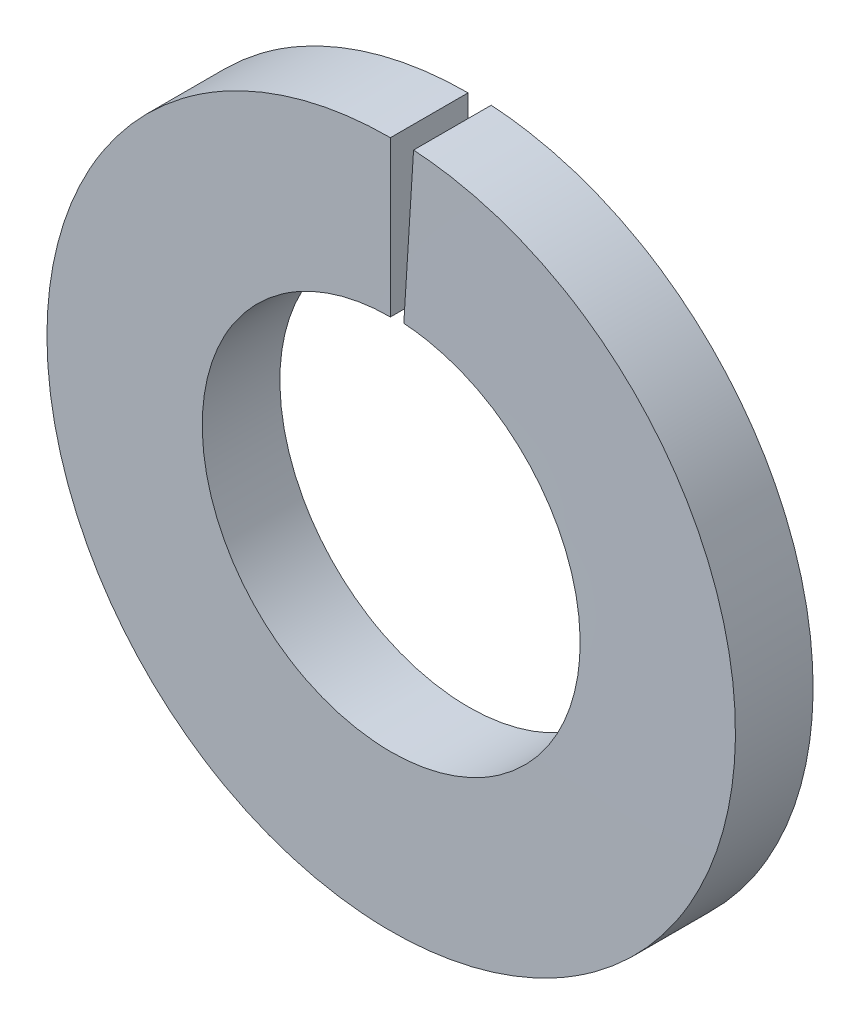
ISO-10303-21;
HEADER;
FILE_DESCRIPTION(('STEP AP214'),'2;1');
FILE_NAME('part.step','',(''),(''),'','','');
FILE_SCHEMA(('AUTOMOTIVE_DESIGN { 1 0 10303 214 1 1 1 1 }'));
ENDSEC;
DATA;
#1=APPLICATION_CONTEXT('core data for automotive mechanical design processes');
#2=APPLICATION_PROTOCOL_DEFINITION('international standard','automotive_design',2000,#1);
#3=PRODUCT_CONTEXT('',#1,'mechanical');
#4=PRODUCT('Part','Part','',(#3));
#5=PRODUCT_RELATED_PRODUCT_CATEGORY('part','',(#4));
#6=PRODUCT_DEFINITION_FORMATION('','',#4);
#7=PRODUCT_DEFINITION_CONTEXT('part definition',#1,'design');
#8=PRODUCT_DEFINITION('design','',#6,#7);
#9=PRODUCT_DEFINITION_SHAPE('','',#8);
#10=(LENGTH_UNIT() NAMED_UNIT(*) SI_UNIT(.MILLI.,.METRE.));
#11=(NAMED_UNIT(*) PLANE_ANGLE_UNIT() SI_UNIT($,.RADIAN.));
#12=(NAMED_UNIT(*) SI_UNIT($,.STERADIAN.) SOLID_ANGLE_UNIT());
#13=UNCERTAINTY_MEASURE_WITH_UNIT(LENGTH_MEASURE(1.E-05),#10,'distance_accuracy_value','');
#14=(GEOMETRIC_REPRESENTATION_CONTEXT(3) GLOBAL_UNCERTAINTY_ASSIGNED_CONTEXT((#13)) GLOBAL_UNIT_ASSIGNED_CONTEXT((#10,
#11,#12)) REPRESENTATION_CONTEXT('',''));
#15=CARTESIAN_POINT('',(0.,0.,0.));
#16=DIRECTION('',(0.,0.,1.));
#17=DIRECTION('',(1.,0.,0.));
#18=AXIS2_PLACEMENT_3D('',#15,#16,#17);
#19=CARTESIAN_POINT('',(0.,1.7,0.));
#20=DIRECTION('',(-1.,0.,0.));
#21=DIRECTION('',(0.,0.,1.));
#22=AXIS2_PLACEMENT_3D('',#19,#20,#21);
#23=PLANE('',#22);
#24=DIRECTION('',(0.,1.,0.));
#25=VECTOR('',#24,1.);
#26=CARTESIAN_POINT('',(0.,3.1,0.));
#27=LINE('',#26,#25);
#28=CARTESIAN_POINT('',(0.,1.7,0.));
#29=VERTEX_POINT('',#28);
#30=CARTESIAN_POINT('',(0.,3.1,0.));
#31=VERTEX_POINT('',#30);
#32=EDGE_CURVE('E73',#29,#31,#27,.T.);
#33=ORIENTED_EDGE('',*,*,#32,.T.);
#34=DIRECTION('',(0.,0.,1.));
#35=VECTOR('',#34,1.);
#36=CARTESIAN_POINT('',(0.,3.1,0.));
#37=LINE('',#36,#35);
#38=CARTESIAN_POINT('',(0.,3.1,0.7));
#39=VERTEX_POINT('',#38);
#40=EDGE_CURVE('E68',#31,#39,#37,.T.);
#41=ORIENTED_EDGE('',*,*,#40,.T.);
#42=DIRECTION('',(0.,-1.,0.));
#43=VECTOR('',#42,1.);
#44=CARTESIAN_POINT('',(0.,3.1,0.7));
#45=LINE('',#44,#43);
#46=CARTESIAN_POINT('',(0.,1.7,0.7));
#47=VERTEX_POINT('',#46);
#48=EDGE_CURVE('E85',#39,#47,#45,.T.);
#49=ORIENTED_EDGE('',*,*,#48,.T.);
#50=DIRECTION('',(0.,0.,-1.));
#51=VECTOR('',#50,1.);
#52=CARTESIAN_POINT('',(0.,1.7,0.));
#53=LINE('',#52,#51);
#54=EDGE_CURVE('E78',#47,#29,#53,.T.);
#55=ORIENTED_EDGE('',*,*,#54,.T.);
#56=EDGE_LOOP('',(#33,#41,#49,#55));
#57=FACE_BOUND('',#56,.T.);
#58=ADVANCED_FACE('F33',(#57),#23,.F.);
#59=CARTESIAN_POINT('',(0.106743883199811,1.69664543832806,-0.014));
#60=DIRECTION('',(-0.998026728428272,0.0627905195293009,0.));
#61=DIRECTION('',(0.,0.,1.));
#62=AXIS2_PLACEMENT_3D('',#59,#60,#61);
#63=PLANE('',#62);
#64=DIRECTION('',(0.0627905195293009,0.998026728428272,0.));
#65=VECTOR('',#64,1.);
#66=CARTESIAN_POINT('',(0.194650610540833,3.09388285812764,-0.014));
#67=LINE('',#66,#65);
#68=CARTESIAN_POINT('',(0.106743883199811,1.69664543832806,-0.014));
#69=VERTEX_POINT('',#68);
#70=CARTESIAN_POINT('',(0.194650610540833,3.09388285812764,-0.014));
#71=VERTEX_POINT('',#70);
#72=EDGE_CURVE('E47',#69,#71,#67,.T.);
#73=ORIENTED_EDGE('',*,*,#72,.F.);
#74=DIRECTION('',(0.,0.,-1.));
#75=VECTOR('',#74,1.);
#76=CARTESIAN_POINT('',(0.106743883199811,1.69664543832806,-0.014));
#77=LINE('',#76,#75);
#78=CARTESIAN_POINT('',(0.106743883199805,1.69664543832806,0.686));
#79=VERTEX_POINT('',#78);
#80=EDGE_CURVE('E56',#79,#69,#77,.T.);
#81=ORIENTED_EDGE('',*,*,#80,.F.);
#82=DIRECTION('',(-0.0627905195293009,-0.998026728428272,0.));
#83=VECTOR('',#82,1.);
#84=CARTESIAN_POINT('',(0.194650610540833,3.09388285812764,0.686));
#85=LINE('',#84,#83);
#86=CARTESIAN_POINT('',(0.194650610540822,3.09388285812764,0.686));
#87=VERTEX_POINT('',#86);
#88=EDGE_CURVE('E93',#87,#79,#85,.T.);
#89=ORIENTED_EDGE('',*,*,#88,.F.);
#90=DIRECTION('',(0.,0.,1.));
#91=VECTOR('',#90,1.);
#92=CARTESIAN_POINT('',(0.194650610540833,3.09388285812764,-0.014));
#93=LINE('',#92,#91);
#94=EDGE_CURVE('E11',#71,#87,#93,.T.);
#95=ORIENTED_EDGE('',*,*,#94,.F.);
#96=EDGE_LOOP('',(#73,#81,#89,#95));
#97=FACE_BOUND('',#96,.T.);
#98=ADVANCED_FACE('F143',(#97),#63,.T.);
#99=CARTESIAN_POINT('',(0.,3.1,0.7));
#100=CARTESIAN_POINT('',(-1.76820878198722,3.1,0.698833333333333));
#101=CARTESIAN_POINT('',(-2.66830028371223,1.57802838882614,0.697666666666667));
#102=CARTESIAN_POINT('',(-3.56839178543724,0.0560567776522846,0.6965));
#103=CARTESIAN_POINT('',(-2.71655070813597,-1.49343638971533,0.695333333333333));
#104=CARTESIAN_POINT('',(-1.8647096308347,-3.04292955708295,0.694166666666667));
#105=CARTESIAN_POINT('',(-0.0973733531421673,-3.09847033713377,0.693));
#106=CARTESIAN_POINT('',(1.66996292455036,-3.15401111718458,0.691833333333334));
#107=CARTESIAN_POINT('',(2.61741656905627,-1.66106306443486,0.690666666666667));
#108=CARTESIAN_POINT('',(3.56487021356218,-0.168115011685129,0.6895));
#109=CARTESIAN_POINT('',(2.76212022498392,1.40737054919264,0.688333333333333));
#110=CARTESIAN_POINT('',(1.95937023640566,2.98285611007041,0.687166666666667));
#111=CARTESIAN_POINT('',(0.194650610540811,3.09388285812765,0.686));
#112=CARTESIAN_POINT('',(0.,1.7,0.7));
#113=CARTESIAN_POINT('',(-0.969662880444605,1.7,0.698833333333333));
#114=CARTESIAN_POINT('',(-1.46326144590671,0.865370406775626,0.697666666666666));
#115=CARTESIAN_POINT('',(-1.95686001136881,0.0307408135512528,0.6965));
#116=CARTESIAN_POINT('',(-1.48972135607456,-0.818981245972925,0.695333333333333));
#117=CARTESIAN_POINT('',(-1.02258270078032,-1.6687033054971,0.694166666666666));
#118=CARTESIAN_POINT('',(-0.0533982904328014,-1.69916115262174,0.693));
#119=CARTESIAN_POINT('',(0.915786119914713,-1.72961899974638,0.691833333333333));
#120=CARTESIAN_POINT('',(1.43535747335344,-0.910905551464276,0.690666666666666));
#121=CARTESIAN_POINT('',(1.95492882679216,-0.0921921031821677,0.6895));
#122=CARTESIAN_POINT('',(1.51471109112021,0.771783849557253,0.688333333333333));
#123=CARTESIAN_POINT('',(1.07449335544826,1.63575980229667,0.687166666666666));
#124=CARTESIAN_POINT('',(0.106743883199799,1.69664543832806,0.686));
#125=(BOUNDED_SURFACE() B_SPLINE_SURFACE(1,2,((#99,#100,#101,#102,#103,#104,#105,#106,#107,#108,
#109,#110,#111),(#112,#113,#114,#115,#116,#117,#118,#119,#120,#121,#122,#123,#124)),
.UNSPECIFIED.,.F.,.F.,.F.) B_SPLINE_SURFACE_WITH_KNOTS((2,2),(3,2,2,2,2,2,3),(0.,1.),(0.,
0.166666666666667,0.333333333333333,0.5,0.666666666666667,0.833333333333333,1.),
.UNSPECIFIED.) GEOMETRIC_REPRESENTATION_ITEM() RATIONAL_B_SPLINE_SURFACE(((1.,0.86863151443819,
1.,0.86863151443819,1.,0.86863151443819,1.,0.86863151443819,1.,0.86863151443819,1.,
0.86863151443819,1.),(1.,0.86863151443819,1.,0.86863151443819,1.,0.86863151443819,1.,
0.86863151443819,1.,0.86863151443819,1.,0.86863151443819,1.))) REPRESENTATION_ITEM('') SURFACE());
#126=CARTESIAN_POINT('',(0.,1.7,0.7));
#127=CARTESIAN_POINT('',(-0.969662880444605,1.7,0.698833333333333));
#128=CARTESIAN_POINT('',(-1.46326144590671,0.865370406775626,0.697666666666666));
#129=CARTESIAN_POINT('',(-1.95686001136881,0.0307408135512528,0.6965));
#130=CARTESIAN_POINT('',(-1.48972135607456,-0.818981245972925,0.695333333333333));
#131=CARTESIAN_POINT('',(-1.02258270078032,-1.6687033054971,0.694166666666666));
#132=CARTESIAN_POINT('',(-0.0533982904328014,-1.69916115262174,0.693));
#133=CARTESIAN_POINT('',(0.915786119914713,-1.72961899974638,0.691833333333333));
#134=CARTESIAN_POINT('',(1.43535747335344,-0.910905551464276,0.690666666666666));
#135=CARTESIAN_POINT('',(1.95492882679216,-0.0921921031821677,0.6895));
#136=CARTESIAN_POINT('',(1.51471109112021,0.771783849557253,0.688333333333333));
#137=CARTESIAN_POINT('',(1.07449335544826,1.63575980229667,0.687166666666666));
#138=CARTESIAN_POINT('',(0.106743883199799,1.69664543832806,0.686));
#139=(BOUNDED_CURVE() B_SPLINE_CURVE(2,(#126,#127,#128,#129,#130,#131,#132,#133,#134,#135,#136,
#137,#138),.UNSPECIFIED.,.F.,.F.) B_SPLINE_CURVE_WITH_KNOTS((3,2,2,2,2,2,3),(0.,
0.166666666666667,0.333333333333333,0.5,0.666666666666667,0.833333333333333,1.),
.UNSPECIFIED.) CURVE() GEOMETRIC_REPRESENTATION_ITEM() RATIONAL_B_SPLINE_CURVE((1.,
0.86863151443819,1.,0.86863151443819,1.,0.86863151443819,1.,0.86863151443819,1.,
0.86863151443819,1.,0.86863151443819,1.)) REPRESENTATION_ITEM(''));
#140=EDGE_CURVE('E88',#47,#79,#139,.T.);
#141=CARTESIAN_POINT('',(0.,3.1,0.7));
#142=CARTESIAN_POINT('',(-1.76820878198722,3.1,0.698833333333333));
#143=CARTESIAN_POINT('',(-2.66830028371223,1.57802838882614,0.697666666666667));
#144=CARTESIAN_POINT('',(-3.56839178543724,0.0560567776522846,0.6965));
#145=CARTESIAN_POINT('',(-2.71655070813597,-1.49343638971533,0.695333333333333));
#146=CARTESIAN_POINT('',(-1.8647096308347,-3.04292955708295,0.694166666666667));
#147=CARTESIAN_POINT('',(-0.0973733531421673,-3.09847033713377,0.693));
#148=CARTESIAN_POINT('',(1.66996292455036,-3.15401111718458,0.691833333333334));
#149=CARTESIAN_POINT('',(2.61741656905627,-1.66106306443486,0.690666666666667));
#150=CARTESIAN_POINT('',(3.56487021356218,-0.168115011685129,0.6895));
#151=CARTESIAN_POINT('',(2.76212022498392,1.40737054919264,0.688333333333333));
#152=CARTESIAN_POINT('',(1.95937023640566,2.98285611007041,0.687166666666667));
#153=CARTESIAN_POINT('',(0.194650610540811,3.09388285812765,0.686));
#154=(BOUNDED_CURVE() B_SPLINE_CURVE(2,(#141,#142,#143,#144,#145,#146,#147,#148,#149,#150,#151,
#152,#153),.UNSPECIFIED.,.F.,.F.) B_SPLINE_CURVE_WITH_KNOTS((3,2,2,2,2,2,3),(0.,
0.166666666666667,0.333333333333333,0.5,0.666666666666667,0.833333333333333,1.),
.UNSPECIFIED.) CURVE() GEOMETRIC_REPRESENTATION_ITEM() RATIONAL_B_SPLINE_CURVE((1.,
0.86863151443819,1.,0.86863151443819,1.,0.86863151443819,1.,0.86863151443819,1.,
0.86863151443819,1.,0.86863151443819,1.)) REPRESENTATION_ITEM(''));
#155=EDGE_CURVE('E87',#39,#87,#154,.T.);
#156=ORIENTED_EDGE('',*,*,#140,.F.);
#157=ORIENTED_EDGE('',*,*,#48,.F.);
#158=ORIENTED_EDGE('',*,*,#155,.T.);
#159=ORIENTED_EDGE('',*,*,#88,.T.);
#160=EDGE_LOOP('',(#156,#157,#158,#159));
#161=FACE_BOUND('',#160,.T.);
#162=ADVANCED_FACE('F86',(#161),#125,.F.);
#163=CARTESIAN_POINT('',(0.,0.,0.));
#164=DIRECTION('',(0.,0.,-1.));
#165=DIRECTION('',(-1.,0.,0.));
#166=AXIS2_PLACEMENT_3D('',#163,#164,#165);
#167=CYLINDRICAL_SURFACE('',#166,1.7);
#168=CARTESIAN_POINT('',(0.,1.7,0.));
#169=CARTESIAN_POINT('',(-0.969662880444604,1.7,-0.00116666666666667));
#170=CARTESIAN_POINT('',(-1.46326144590671,0.865370406775628,-0.00233333333333333));
#171=CARTESIAN_POINT('',(-1.95686001136881,0.0307408135512563,-0.0035));
#172=CARTESIAN_POINT('',(-1.48972135607456,-0.818981245972922,-0.00466666666666667));
#173=CARTESIAN_POINT('',(-1.02258270078032,-1.6687033054971,-0.00583333333333333));
#174=CARTESIAN_POINT('',(-0.0533982904328074,-1.69916115262174,-0.007));
#175=CARTESIAN_POINT('',(0.915786119914706,-1.72961899974639,-0.00816666666666667));
#176=CARTESIAN_POINT('',(1.43535747335343,-0.910905551464282,-0.00933333333333333));
#177=CARTESIAN_POINT('',(1.95492882679216,-0.0921921031821763,-0.0105));
#178=CARTESIAN_POINT('',(1.51471109112022,0.771783849557245,-0.0116666666666667));
#179=CARTESIAN_POINT('',(1.07449335544827,1.63575980229667,-0.0128333333333333));
#180=CARTESIAN_POINT('',(0.106743883199811,1.69664543832806,-0.014));
#181=(BOUNDED_CURVE() B_SPLINE_CURVE(2,(#168,#169,#170,#171,#172,#173,#174,#175,#176,#177,#178,
#179,#180),.UNSPECIFIED.,.F.,.F.) B_SPLINE_CURVE_WITH_KNOTS((3,2,2,2,2,2,3),(0.,
0.166666666666667,0.333333333333333,0.5,0.666666666666667,0.833333333333333,1.),
.UNSPECIFIED.) CURVE() GEOMETRIC_REPRESENTATION_ITEM() RATIONAL_B_SPLINE_CURVE((1.,
0.868631514438191,1.,0.868631514438191,1.,0.868631514438191,1.,0.868631514438191,1.,
0.868631514438191,1.,0.868631514438191,1.)) REPRESENTATION_ITEM(''));
#182=EDGE_CURVE('E108',#29,#69,#181,.T.);
#183=ORIENTED_EDGE('',*,*,#182,.F.);
#184=ORIENTED_EDGE('',*,*,#54,.F.);
#185=ORIENTED_EDGE('',*,*,#140,.T.);
#186=ORIENTED_EDGE('',*,*,#80,.T.);
#187=EDGE_LOOP('',(#183,#184,#185,#186));
#188=FACE_BOUND('',#187,.T.);
#189=ADVANCED_FACE('F126',(#188),#167,.F.);
#190=CARTESIAN_POINT('',(0.,1.7,0.));
#191=CARTESIAN_POINT('',(-0.969662880444604,1.7,-0.00116666666666667));
#192=CARTESIAN_POINT('',(-1.46326144590671,0.865370406775628,-0.00233333333333333));
#193=CARTESIAN_POINT('',(-1.95686001136881,0.0307408135512563,-0.0035));
#194=CARTESIAN_POINT('',(-1.48972135607456,-0.818981245972922,-0.00466666666666667));
#195=CARTESIAN_POINT('',(-1.02258270078032,-1.6687033054971,-0.00583333333333333));
#196=CARTESIAN_POINT('',(-0.0533982904328074,-1.69916115262174,-0.007));
#197=CARTESIAN_POINT('',(0.915786119914706,-1.72961899974639,-0.00816666666666667));
#198=CARTESIAN_POINT('',(1.43535747335343,-0.910905551464282,-0.00933333333333333));
#199=CARTESIAN_POINT('',(1.95492882679216,-0.0921921031821763,-0.0105));
#200=CARTESIAN_POINT('',(1.51471109112022,0.771783849557245,-0.0116666666666667));
#201=CARTESIAN_POINT('',(1.07449335544827,1.63575980229667,-0.0128333333333333));
#202=CARTESIAN_POINT('',(0.106743883199811,1.69664543832806,-0.014));
#203=CARTESIAN_POINT('',(0.,3.1,0.));
#204=CARTESIAN_POINT('',(-1.76820878198722,3.1,-0.00116666666666667));
#205=CARTESIAN_POINT('',(-2.66830028371223,1.57802838882615,-0.00233333333333333));
#206=CARTESIAN_POINT('',(-3.56839178543724,0.0560567776522909,-0.0035));
#207=CARTESIAN_POINT('',(-2.71655070813597,-1.49343638971533,-0.00466666666666667));
#208=CARTESIAN_POINT('',(-1.8647096308347,-3.04292955708295,-0.00583333333333333));
#209=CARTESIAN_POINT('',(-0.0973733531421783,-3.09847033713377,-0.007));
#210=CARTESIAN_POINT('',(1.66996292455035,-3.15401111718459,-0.00816666666666667));
#211=CARTESIAN_POINT('',(2.61741656905626,-1.66106306443487,-0.00933333333333333));
#212=CARTESIAN_POINT('',(3.56487021356218,-0.168115011685145,-0.0105));
#213=CARTESIAN_POINT('',(2.76212022498393,1.40737054919262,-0.0116666666666667));
#214=CARTESIAN_POINT('',(1.95937023640568,2.98285611007039,-0.0128333333333333));
#215=CARTESIAN_POINT('',(0.194650610540833,3.09388285812764,-0.014));
#216=(BOUNDED_SURFACE() B_SPLINE_SURFACE(1,2,((#190,#191,#192,#193,#194,#195,#196,#197,#198,
#199,#200,#201,#202),(#203,#204,#205,#206,#207,#208,#209,#210,#211,#212,#213,#214,#215)),
.UNSPECIFIED.,.F.,.F.,.F.) B_SPLINE_SURFACE_WITH_KNOTS((2,2),(3,2,2,2,2,2,3),(0.,1.),(0.,
0.166666666666667,0.333333333333333,0.5,0.666666666666667,0.833333333333333,1.),
.UNSPECIFIED.) GEOMETRIC_REPRESENTATION_ITEM() RATIONAL_B_SPLINE_SURFACE(((1.,0.868631514438191,
1.,0.868631514438191,1.,0.868631514438191,1.,0.868631514438191,1.,0.868631514438191,1.,
0.868631514438191,1.),(1.,0.868631514438191,1.,0.868631514438191,1.,0.868631514438191,1.,
0.868631514438191,1.,0.868631514438191,1.,0.868631514438191,1.))) REPRESENTATION_ITEM('') SURFACE());
#217=CARTESIAN_POINT('',(0.,3.1,0.));
#218=CARTESIAN_POINT('',(-1.76820878198722,3.1,-0.00116666666666667));
#219=CARTESIAN_POINT('',(-2.66830028371223,1.57802838882615,-0.00233333333333333));
#220=CARTESIAN_POINT('',(-3.56839178543724,0.0560567776522909,-0.0035));
#221=CARTESIAN_POINT('',(-2.71655070813597,-1.49343638971533,-0.00466666666666667));
#222=CARTESIAN_POINT('',(-1.8647096308347,-3.04292955708295,-0.00583333333333333));
#223=CARTESIAN_POINT('',(-0.0973733531421783,-3.09847033713377,-0.007));
#224=CARTESIAN_POINT('',(1.66996292455035,-3.15401111718459,-0.00816666666666667));
#225=CARTESIAN_POINT('',(2.61741656905626,-1.66106306443487,-0.00933333333333333));
#226=CARTESIAN_POINT('',(3.56487021356218,-0.168115011685145,-0.0105));
#227=CARTESIAN_POINT('',(2.76212022498393,1.40737054919262,-0.0116666666666667));
#228=CARTESIAN_POINT('',(1.95937023640568,2.98285611007039,-0.0128333333333333));
#229=CARTESIAN_POINT('',(0.194650610540833,3.09388285812764,-0.014));
#230=(BOUNDED_CURVE() B_SPLINE_CURVE(2,(#217,#218,#219,#220,#221,#222,#223,#224,#225,#226,#227,
#228,#229),.UNSPECIFIED.,.F.,.F.) B_SPLINE_CURVE_WITH_KNOTS((3,2,2,2,2,2,3),(0.,
0.166666666666667,0.333333333333333,0.5,0.666666666666667,0.833333333333333,1.),
.UNSPECIFIED.) CURVE() GEOMETRIC_REPRESENTATION_ITEM() RATIONAL_B_SPLINE_CURVE((1.,
0.868631514438191,1.,0.868631514438191,1.,0.868631514438191,1.,0.868631514438191,1.,
0.868631514438191,1.,0.868631514438191,1.)) REPRESENTATION_ITEM(''));
#231=EDGE_CURVE('E40',#31,#71,#230,.T.);
#232=ORIENTED_EDGE('',*,*,#231,.F.);
#233=ORIENTED_EDGE('',*,*,#32,.F.);
#234=ORIENTED_EDGE('',*,*,#182,.T.);
#235=ORIENTED_EDGE('',*,*,#72,.T.);
#236=EDGE_LOOP('',(#232,#233,#234,#235));
#237=FACE_BOUND('',#236,.T.);
#238=ADVANCED_FACE('F124',(#237),#216,.F.);
#239=CARTESIAN_POINT('',(0.,0.,0.));
#240=DIRECTION('',(0.,0.,-1.));
#241=DIRECTION('',(-1.,0.,0.));
#242=AXIS2_PLACEMENT_3D('',#239,#240,#241);
#243=CYLINDRICAL_SURFACE('',#242,3.1);
#244=ORIENTED_EDGE('',*,*,#94,.T.);
#245=ORIENTED_EDGE('',*,*,#155,.F.);
#246=ORIENTED_EDGE('',*,*,#40,.F.);
#247=ORIENTED_EDGE('',*,*,#231,.T.);
#248=EDGE_LOOP('',(#244,#245,#246,#247));
#249=FACE_BOUND('',#248,.T.);
#250=ADVANCED_FACE('F91',(#249),#243,.T.);
#251=CLOSED_SHELL('',(#58,#98,#162,#189,#238,#250));
#252=MANIFOLD_SOLID_BREP('B2',#251);
#253=ADVANCED_BREP_SHAPE_REPRESENTATION('',(#18,#252),#14);
#254=SHAPE_DEFINITION_REPRESENTATION(#9,#253);
ENDSEC;
END-ISO-10303-21;
